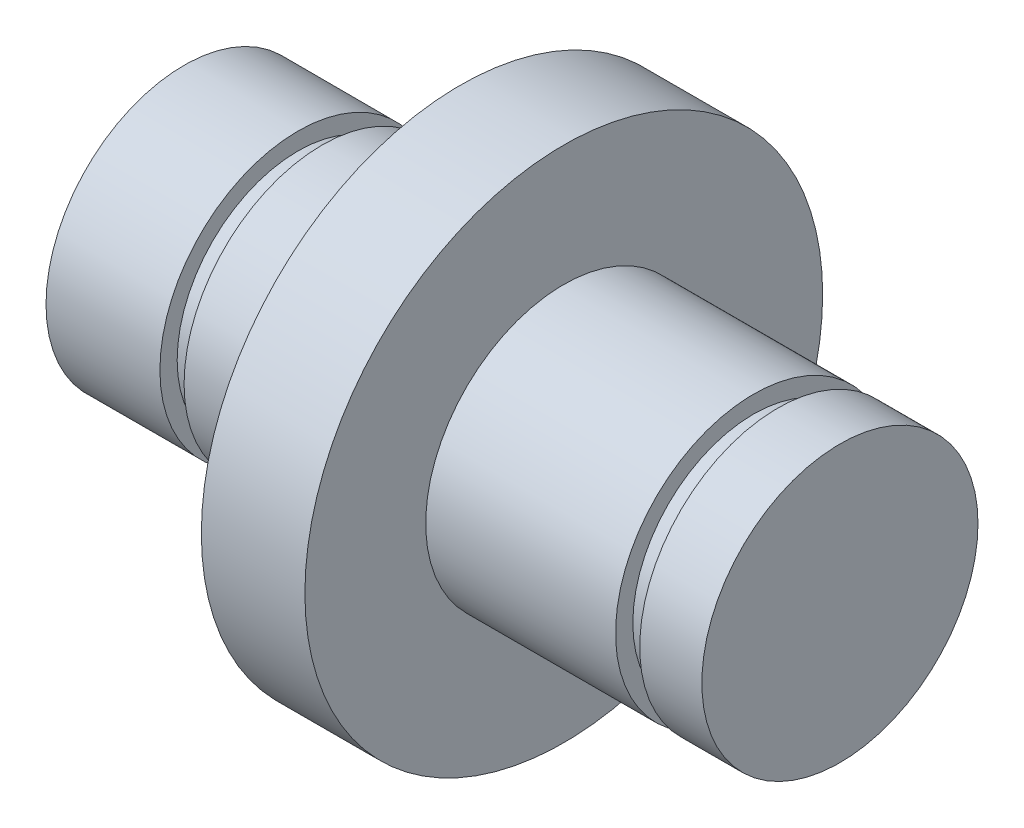
ISO-10303-21;
HEADER;
FILE_DESCRIPTION(('STEP AP214'),'2;1');
FILE_NAME('part.step','',(''),(''),'','','');
FILE_SCHEMA(('AUTOMOTIVE_DESIGN { 1 0 10303 214 1 1 1 1 }'));
ENDSEC;
DATA;
#1=APPLICATION_CONTEXT('core data for automotive mechanical design processes');
#2=APPLICATION_PROTOCOL_DEFINITION('international standard','automotive_design',2000,#1);
#3=PRODUCT_CONTEXT('',#1,'mechanical');
#4=PRODUCT('Part','Part','',(#3));
#5=PRODUCT_RELATED_PRODUCT_CATEGORY('part','',(#4));
#6=PRODUCT_DEFINITION_FORMATION('','',#4);
#7=PRODUCT_DEFINITION_CONTEXT('part definition',#1,'design');
#8=PRODUCT_DEFINITION('design','',#6,#7);
#9=PRODUCT_DEFINITION_SHAPE('','',#8);
#10=(LENGTH_UNIT() NAMED_UNIT(*) SI_UNIT(.MILLI.,.METRE.));
#11=(NAMED_UNIT(*) PLANE_ANGLE_UNIT() SI_UNIT($,.RADIAN.));
#12=(NAMED_UNIT(*) SI_UNIT($,.STERADIAN.) SOLID_ANGLE_UNIT());
#13=UNCERTAINTY_MEASURE_WITH_UNIT(LENGTH_MEASURE(1.E-05),#10,'distance_accuracy_value','');
#14=(GEOMETRIC_REPRESENTATION_CONTEXT(3) GLOBAL_UNCERTAINTY_ASSIGNED_CONTEXT((#13)) GLOBAL_UNIT_ASSIGNED_CONTEXT((#10,
#11,#12)) REPRESENTATION_CONTEXT('',''));
#15=CARTESIAN_POINT('',(0.,0.,0.));
#16=DIRECTION('',(0.,0.,1.));
#17=DIRECTION('',(1.,0.,0.));
#18=AXIS2_PLACEMENT_3D('',#15,#16,#17);
#19=CARTESIAN_POINT('',(-1.5,0.,0.));
#20=DIRECTION('',(-1.,0.,0.));
#21=DIRECTION('',(0.,0.,1.));
#22=AXIS2_PLACEMENT_3D('',#19,#20,#21);
#23=CYLINDRICAL_SURFACE('',#22,4.);
#24=CARTESIAN_POINT('',(-1.5,0.,0.));
#25=DIRECTION('',(-1.,0.,0.));
#26=DIRECTION('',(0.,0.,1.));
#27=AXIS2_PLACEMENT_3D('',#24,#25,#26);
#28=CIRCLE('',#27,4.);
#29=CARTESIAN_POINT('',(-1.5,0.,4.));
#30=VERTEX_POINT('',#29);
#31=EDGE_CURVE('E61',#30,#30,#28,.T.);
#32=ORIENTED_EDGE('',*,*,#31,.T.);
#33=EDGE_LOOP('',(#32));
#34=FACE_BOUND('',#33,.T.);
#35=CARTESIAN_POINT('',(-5.5,0.,0.));
#36=DIRECTION('',(1.,0.,0.));
#37=DIRECTION('',(0.,0.,-1.));
#38=AXIS2_PLACEMENT_3D('',#35,#36,#37);
#39=CIRCLE('',#38,4.);
#40=CARTESIAN_POINT('',(-5.5,0.,-4.));
#41=VERTEX_POINT('',#40);
#42=EDGE_CURVE('E94',#41,#41,#39,.T.);
#43=ORIENTED_EDGE('',*,*,#42,.T.);
#44=EDGE_LOOP('',(#43));
#45=FACE_BOUND('',#44,.T.);
#46=ADVANCED_FACE('F37',(#34,#45),#23,.T.);
#47=CARTESIAN_POINT('',(9.5,0.,0.));
#48=DIRECTION('',(-1.,0.,0.));
#49=DIRECTION('',(0.,0.,1.));
#50=AXIS2_PLACEMENT_3D('',#47,#48,#49);
#51=CYLINDRICAL_SURFACE('',#50,7.5);
#52=CARTESIAN_POINT('',(1.5,0.,0.));
#53=DIRECTION('',(1.,0.,0.));
#54=DIRECTION('',(0.,0.,-1.));
#55=AXIS2_PLACEMENT_3D('',#52,#53,#54);
#56=CIRCLE('',#55,7.5);
#57=CARTESIAN_POINT('',(1.5,0.,-7.5));
#58=VERTEX_POINT('',#57);
#59=EDGE_CURVE('E10',#58,#58,#56,.T.);
#60=ORIENTED_EDGE('',*,*,#59,.F.);
#61=EDGE_LOOP('',(#60));
#62=FACE_BOUND('',#61,.T.);
#63=CARTESIAN_POINT('',(-1.5,0.,0.));
#64=DIRECTION('',(-1.,0.,0.));
#65=DIRECTION('',(0.,0.,1.));
#66=AXIS2_PLACEMENT_3D('',#63,#64,#65);
#67=CIRCLE('',#66,7.5);
#68=CARTESIAN_POINT('',(-1.5,0.,7.5));
#69=VERTEX_POINT('',#68);
#70=EDGE_CURVE('E56',#69,#69,#67,.T.);
#71=ORIENTED_EDGE('',*,*,#70,.F.);
#72=EDGE_LOOP('',(#71));
#73=FACE_BOUND('',#72,.T.);
#74=ADVANCED_FACE('F39',(#62,#73),#51,.T.);
#75=CARTESIAN_POINT('',(1.5,0.,0.));
#76=DIRECTION('',(1.,0.,0.));
#77=DIRECTION('',(0.,0.,-1.));
#78=AXIS2_PLACEMENT_3D('',#75,#76,#77);
#79=PLANE('',#78);
#80=CARTESIAN_POINT('',(1.5,0.,0.));
#81=DIRECTION('',(1.,0.,0.));
#82=DIRECTION('',(0.,0.,-1.));
#83=AXIS2_PLACEMENT_3D('',#80,#81,#82);
#84=CIRCLE('',#83,4.);
#85=CARTESIAN_POINT('',(1.5,0.,-4.));
#86=VERTEX_POINT('',#85);
#87=EDGE_CURVE('E45',#86,#86,#84,.T.);
#88=ORIENTED_EDGE('',*,*,#87,.F.);
#89=EDGE_LOOP('',(#88));
#90=FACE_BOUND('',#89,.T.);
#91=ORIENTED_EDGE('',*,*,#59,.T.);
#92=EDGE_LOOP('',(#91));
#93=FACE_BOUND('',#92,.T.);
#94=ADVANCED_FACE('F126',(#90,#93),#79,.T.);
#95=CARTESIAN_POINT('',(1.5,0.,0.));
#96=DIRECTION('',(1.,0.,0.));
#97=DIRECTION('',(0.,0.,-1.));
#98=AXIS2_PLACEMENT_3D('',#95,#96,#97);
#99=CYLINDRICAL_SURFACE('',#98,4.);
#100=CARTESIAN_POINT('',(7.,0.,0.));
#101=DIRECTION('',(1.,0.,0.));
#102=DIRECTION('',(0.,0.,-1.));
#103=AXIS2_PLACEMENT_3D('',#100,#101,#102);
#104=CIRCLE('',#103,4.);
#105=CARTESIAN_POINT('',(7.,0.,-4.));
#106=VERTEX_POINT('',#105);
#107=EDGE_CURVE('E75',#106,#106,#104,.T.);
#108=ORIENTED_EDGE('',*,*,#107,.F.);
#109=EDGE_LOOP('',(#108));
#110=FACE_BOUND('',#109,.T.);
#111=ORIENTED_EDGE('',*,*,#87,.T.);
#112=EDGE_LOOP('',(#111));
#113=FACE_BOUND('',#112,.T.);
#114=ADVANCED_FACE('F136',(#110,#113),#99,.T.);
#115=CARTESIAN_POINT('',(-1.5,0.,0.));
#116=DIRECTION('',(-1.,0.,0.));
#117=DIRECTION('',(0.,0.,1.));
#118=AXIS2_PLACEMENT_3D('',#115,#116,#117);
#119=PLANE('',#118);
#120=ORIENTED_EDGE('',*,*,#31,.F.);
#121=EDGE_LOOP('',(#120));
#122=FACE_BOUND('',#121,.T.);
#123=ORIENTED_EDGE('',*,*,#70,.T.);
#124=EDGE_LOOP('',(#123));
#125=FACE_BOUND('',#124,.T.);
#126=ADVANCED_FACE('F133',(#122,#125),#119,.T.);
#127=CARTESIAN_POINT('',(-6.2,4.,0.));
#128=DIRECTION('',(-1.,0.,0.));
#129=DIRECTION('',(0.,0.,1.));
#130=AXIS2_PLACEMENT_3D('',#127,#128,#129);
#131=PLANE('',#130);
#132=CARTESIAN_POINT('',(-6.2,0.,0.));
#133=DIRECTION('',(1.,0.,0.));
#134=DIRECTION('',(0.,0.,-1.));
#135=AXIS2_PLACEMENT_3D('',#132,#133,#134);
#136=CIRCLE('',#135,3.5);
#137=CARTESIAN_POINT('',(-6.2,0.,-3.5));
#138=VERTEX_POINT('',#137);
#139=EDGE_CURVE('E66',#138,#138,#136,.T.);
#140=ORIENTED_EDGE('',*,*,#139,.F.);
#141=EDGE_LOOP('',(#140));
#142=FACE_BOUND('',#141,.T.);
#143=CARTESIAN_POINT('',(-6.2,0.,0.));
#144=DIRECTION('',(1.,0.,0.));
#145=DIRECTION('',(0.,0.,-1.));
#146=AXIS2_PLACEMENT_3D('',#143,#144,#145);
#147=CIRCLE('',#146,4.);
#148=CARTESIAN_POINT('',(-6.2,0.,-4.));
#149=VERTEX_POINT('',#148);
#150=EDGE_CURVE('E74',#149,#149,#147,.T.);
#151=ORIENTED_EDGE('',*,*,#150,.T.);
#152=EDGE_LOOP('',(#151));
#153=FACE_BOUND('',#152,.T.);
#154=ADVANCED_FACE('F102',(#142,#153),#131,.F.);
#155=CARTESIAN_POINT('',(0.,0.,0.));
#156=DIRECTION('',(1.,0.,0.));
#157=DIRECTION('',(0.,0.,-1.));
#158=AXIS2_PLACEMENT_3D('',#155,#156,#157);
#159=CYLINDRICAL_SURFACE('',#158,3.5);
#160=CARTESIAN_POINT('',(-5.5,0.,0.));
#161=DIRECTION('',(1.,0.,0.));
#162=DIRECTION('',(0.,0.,-1.));
#163=AXIS2_PLACEMENT_3D('',#160,#161,#162);
#164=CIRCLE('',#163,3.5);
#165=CARTESIAN_POINT('',(-5.5,0.,-3.5));
#166=VERTEX_POINT('',#165);
#167=EDGE_CURVE('E90',#166,#166,#164,.T.);
#168=ORIENTED_EDGE('',*,*,#167,.F.);
#169=EDGE_LOOP('',(#168));
#170=FACE_BOUND('',#169,.T.);
#171=ORIENTED_EDGE('',*,*,#139,.T.);
#172=EDGE_LOOP('',(#171));
#173=FACE_BOUND('',#172,.T.);
#174=ADVANCED_FACE('F117',(#170,#173),#159,.T.);
#175=CARTESIAN_POINT('',(-5.5,4.,0.));
#176=DIRECTION('',(-1.,0.,0.));
#177=DIRECTION('',(0.,0.,1.));
#178=AXIS2_PLACEMENT_3D('',#175,#176,#177);
#179=PLANE('',#178);
#180=ORIENTED_EDGE('',*,*,#167,.T.);
#181=EDGE_LOOP('',(#180));
#182=FACE_BOUND('',#181,.T.);
#183=ORIENTED_EDGE('',*,*,#42,.F.);
#184=EDGE_LOOP('',(#183));
#185=FACE_BOUND('',#184,.T.);
#186=ADVANCED_FACE('F113',(#182,#185),#179,.T.);
#187=CARTESIAN_POINT('',(-9.5,0.,0.));
#188=DIRECTION('',(1.,0.,0.));
#189=DIRECTION('',(0.,0.,-1.));
#190=AXIS2_PLACEMENT_3D('',#187,#188,#189);
#191=PLANE('',#190);
#192=CARTESIAN_POINT('',(-9.5,0.,0.));
#193=DIRECTION('',(-1.,0.,0.));
#194=DIRECTION('',(0.,0.,1.));
#195=AXIS2_PLACEMENT_3D('',#192,#193,#194);
#196=CIRCLE('',#195,4.);
#197=CARTESIAN_POINT('',(-9.5,0.,4.));
#198=VERTEX_POINT('',#197);
#199=EDGE_CURVE('E62',#198,#198,#196,.T.);
#200=ORIENTED_EDGE('',*,*,#199,.T.);
#201=EDGE_LOOP('',(#200));
#202=FACE_BOUND('',#201,.T.);
#203=ADVANCED_FACE('F108',(#202),#191,.F.);
#204=ORIENTED_EDGE('',*,*,#150,.F.);
#205=EDGE_LOOP('',(#204));
#206=FACE_BOUND('',#205,.T.);
#207=ORIENTED_EDGE('',*,*,#199,.F.);
#208=EDGE_LOOP('',(#207));
#209=FACE_BOUND('',#208,.T.);
#210=ADVANCED_FACE('F104',(#206,#209),#23,.T.);
#211=CARTESIAN_POINT('',(7.7,4.,0.));
#212=DIRECTION('',(-1.,0.,0.));
#213=DIRECTION('',(0.,0.,1.));
#214=AXIS2_PLACEMENT_3D('',#211,#212,#213);
#215=PLANE('',#214);
#216=CARTESIAN_POINT('',(7.7,0.,0.));
#217=DIRECTION('',(1.,0.,0.));
#218=DIRECTION('',(0.,0.,-1.));
#219=AXIS2_PLACEMENT_3D('',#216,#217,#218);
#220=CIRCLE('',#219,3.5);
#221=CARTESIAN_POINT('',(7.7,0.,-3.5));
#222=VERTEX_POINT('',#221);
#223=EDGE_CURVE('E83',#222,#222,#220,.T.);
#224=ORIENTED_EDGE('',*,*,#223,.T.);
#225=EDGE_LOOP('',(#224));
#226=FACE_BOUND('',#225,.T.);
#227=CARTESIAN_POINT('',(7.7,0.,0.));
#228=DIRECTION('',(1.,0.,0.));
#229=DIRECTION('',(0.,0.,-1.));
#230=AXIS2_PLACEMENT_3D('',#227,#228,#229);
#231=CIRCLE('',#230,4.);
#232=CARTESIAN_POINT('',(7.7,0.,-4.));
#233=VERTEX_POINT('',#232);
#234=EDGE_CURVE('E70',#233,#233,#231,.T.);
#235=ORIENTED_EDGE('',*,*,#234,.F.);
#236=EDGE_LOOP('',(#235));
#237=FACE_BOUND('',#236,.T.);
#238=ADVANCED_FACE('F107',(#226,#237),#215,.T.);
#239=CARTESIAN_POINT('',(0.,0.,0.));
#240=DIRECTION('',(1.,0.,0.));
#241=DIRECTION('',(0.,0.,-1.));
#242=AXIS2_PLACEMENT_3D('',#239,#240,#241);
#243=CYLINDRICAL_SURFACE('',#242,3.5);
#244=CARTESIAN_POINT('',(7.,0.,0.));
#245=DIRECTION('',(1.,0.,0.));
#246=DIRECTION('',(0.,0.,-1.));
#247=AXIS2_PLACEMENT_3D('',#244,#245,#246);
#248=CIRCLE('',#247,3.5);
#249=CARTESIAN_POINT('',(7.,0.,-3.5));
#250=VERTEX_POINT('',#249);
#251=EDGE_CURVE('E79',#250,#250,#248,.T.);
#252=ORIENTED_EDGE('',*,*,#251,.T.);
#253=EDGE_LOOP('',(#252));
#254=FACE_BOUND('',#253,.T.);
#255=ORIENTED_EDGE('',*,*,#223,.F.);
#256=EDGE_LOOP('',(#255));
#257=FACE_BOUND('',#256,.T.);
#258=ADVANCED_FACE('F152',(#254,#257),#243,.T.);
#259=CARTESIAN_POINT('',(7.,4.,0.));
#260=DIRECTION('',(-1.,0.,0.));
#261=DIRECTION('',(0.,0.,1.));
#262=AXIS2_PLACEMENT_3D('',#259,#260,#261);
#263=PLANE('',#262);
#264=ORIENTED_EDGE('',*,*,#251,.F.);
#265=EDGE_LOOP('',(#264));
#266=FACE_BOUND('',#265,.T.);
#267=ORIENTED_EDGE('',*,*,#107,.T.);
#268=EDGE_LOOP('',(#267));
#269=FACE_BOUND('',#268,.T.);
#270=ADVANCED_FACE('F131',(#266,#269),#263,.F.);
#271=CARTESIAN_POINT('',(9.5,0.,0.));
#272=DIRECTION('',(1.,0.,0.));
#273=DIRECTION('',(0.,0.,-1.));
#274=AXIS2_PLACEMENT_3D('',#271,#272,#273);
#275=PLANE('',#274);
#276=CARTESIAN_POINT('',(9.5,0.,0.));
#277=DIRECTION('',(1.,0.,0.));
#278=DIRECTION('',(0.,0.,-1.));
#279=AXIS2_PLACEMENT_3D('',#276,#277,#278);
#280=CIRCLE('',#279,4.);
#281=CARTESIAN_POINT('',(9.5,0.,-4.));
#282=VERTEX_POINT('',#281);
#283=EDGE_CURVE('E50',#282,#282,#280,.T.);
#284=ORIENTED_EDGE('',*,*,#283,.T.);
#285=EDGE_LOOP('',(#284));
#286=FACE_BOUND('',#285,.T.);
#287=ADVANCED_FACE('F144',(#286),#275,.T.);
#288=ORIENTED_EDGE('',*,*,#283,.F.);
#289=EDGE_LOOP('',(#288));
#290=FACE_BOUND('',#289,.T.);
#291=ORIENTED_EDGE('',*,*,#234,.T.);
#292=EDGE_LOOP('',(#291));
#293=FACE_BOUND('',#292,.T.);
#294=ADVANCED_FACE('F141',(#290,#293),#99,.T.);
#295=CLOSED_SHELL('',(#46,#74,#94,#114,#126,#154,#174,#186,#203,#210,#238,#258,#270,#287,#294));
#296=MANIFOLD_SOLID_BREP('B2',#295);
#297=ADVANCED_BREP_SHAPE_REPRESENTATION('',(#18,#296),#14);
#298=SHAPE_DEFINITION_REPRESENTATION(#9,#297);
ENDSEC;
END-ISO-10303-21;
